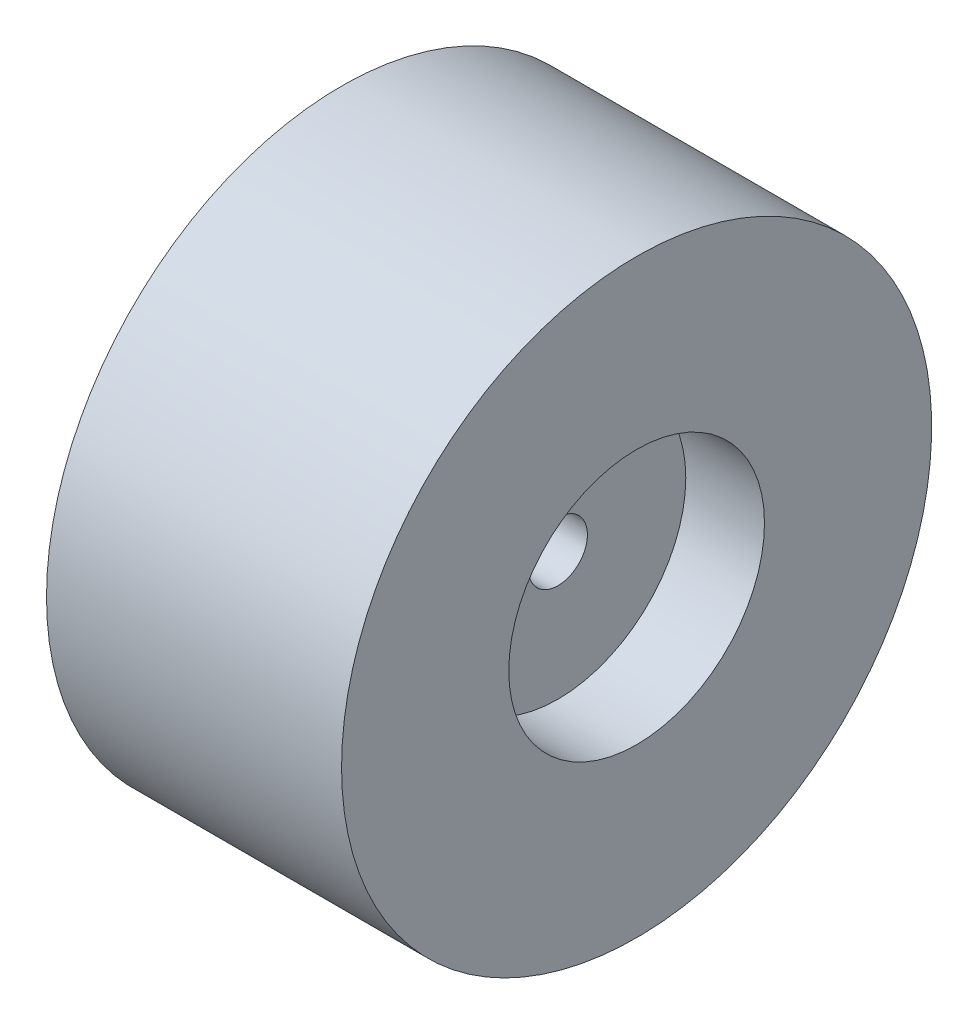
ISO-10303-21;
HEADER;
FILE_DESCRIPTION(('STEP AP214'),'2;1');
FILE_NAME('part.step','',(''),(''),'','','');
FILE_SCHEMA(('AUTOMOTIVE_DESIGN { 1 0 10303 214 1 1 1 1 }'));
ENDSEC;
DATA;
#1=APPLICATION_CONTEXT('core data for automotive mechanical design processes');
#2=APPLICATION_PROTOCOL_DEFINITION('international standard','automotive_design',2000,#1);
#3=PRODUCT_CONTEXT('',#1,'mechanical');
#4=PRODUCT('Part','Part','',(#3));
#5=PRODUCT_RELATED_PRODUCT_CATEGORY('part','',(#4));
#6=PRODUCT_DEFINITION_FORMATION('','',#4);
#7=PRODUCT_DEFINITION_CONTEXT('part definition',#1,'design');
#8=PRODUCT_DEFINITION('design','',#6,#7);
#9=PRODUCT_DEFINITION_SHAPE('','',#8);
#10=(LENGTH_UNIT() NAMED_UNIT(*) SI_UNIT(.MILLI.,.METRE.));
#11=(NAMED_UNIT(*) PLANE_ANGLE_UNIT() SI_UNIT($,.RADIAN.));
#12=(NAMED_UNIT(*) SI_UNIT($,.STERADIAN.) SOLID_ANGLE_UNIT());
#13=UNCERTAINTY_MEASURE_WITH_UNIT(LENGTH_MEASURE(1.E-05),#10,'distance_accuracy_value','');
#14=(GEOMETRIC_REPRESENTATION_CONTEXT(3) GLOBAL_UNCERTAINTY_ASSIGNED_CONTEXT((#13)) GLOBAL_UNIT_ASSIGNED_CONTEXT((#10,
#11,#12)) REPRESENTATION_CONTEXT('',''));
#15=CARTESIAN_POINT('',(0.,0.,0.));
#16=DIRECTION('',(0.,0.,1.));
#17=DIRECTION('',(1.,0.,0.));
#18=AXIS2_PLACEMENT_3D('',#15,#16,#17);
#19=CARTESIAN_POINT('',(-30.,0.,0.));
#20=DIRECTION('',(-1.,0.,0.));
#21=DIRECTION('',(0.,0.,1.));
#22=AXIS2_PLACEMENT_3D('',#19,#20,#21);
#23=CYLINDRICAL_SURFACE('',#22,30.);
#24=CARTESIAN_POINT('',(-30.,0.,0.));
#25=DIRECTION('',(-1.,0.,0.));
#26=DIRECTION('',(0.,0.,1.));
#27=AXIS2_PLACEMENT_3D('',#24,#25,#26);
#28=CIRCLE('',#27,30.);
#29=CARTESIAN_POINT('',(-30.,0.,30.));
#30=VERTEX_POINT('',#29);
#31=EDGE_CURVE('E10',#30,#30,#28,.T.);
#32=ORIENTED_EDGE('',*,*,#31,.F.);
#33=EDGE_LOOP('',(#32));
#34=FACE_BOUND('',#33,.T.);
#35=CARTESIAN_POINT('',(0.,0.,0.));
#36=DIRECTION('',(-1.,0.,0.));
#37=DIRECTION('',(0.,0.,1.));
#38=AXIS2_PLACEMENT_3D('',#35,#36,#37);
#39=CIRCLE('',#38,30.);
#40=CARTESIAN_POINT('',(0.,0.,30.));
#41=VERTEX_POINT('',#40);
#42=EDGE_CURVE('E66',#41,#41,#39,.T.);
#43=ORIENTED_EDGE('',*,*,#42,.T.);
#44=EDGE_LOOP('',(#43));
#45=FACE_BOUND('',#44,.T.);
#46=ADVANCED_FACE('F35',(#34,#45),#23,.T.);
#47=CARTESIAN_POINT('',(-30.,30.,0.));
#48=DIRECTION('',(1.,0.,0.));
#49=DIRECTION('',(0.,0.,-1.));
#50=AXIS2_PLACEMENT_3D('',#47,#48,#49);
#51=PLANE('',#50);
#52=CARTESIAN_POINT('',(-30.,0.,0.));
#53=DIRECTION('',(-1.,0.,0.));
#54=DIRECTION('',(0.,0.,1.));
#55=AXIS2_PLACEMENT_3D('',#52,#53,#54);
#56=CIRCLE('',#55,25.0829037686547);
#57=CARTESIAN_POINT('',(-30.,0.,25.0829037686547));
#58=VERTEX_POINT('',#57);
#59=EDGE_CURVE('E41',#58,#58,#56,.T.);
#60=ORIENTED_EDGE('',*,*,#59,.F.);
#61=EDGE_LOOP('',(#60));
#62=FACE_BOUND('',#61,.T.);
#63=ORIENTED_EDGE('',*,*,#31,.T.);
#64=EDGE_LOOP('',(#63));
#65=FACE_BOUND('',#64,.T.);
#66=ADVANCED_FACE('F109',(#62,#65),#51,.F.);
#67=CARTESIAN_POINT('',(-30.,0.,0.));
#68=DIRECTION('',(-1.,0.,0.));
#69=DIRECTION('',(0.,0.,1.));
#70=AXIS2_PLACEMENT_3D('',#67,#68,#69);
#71=CONICAL_SURFACE('',#70,25.0829037686547,0.785398163397433);
#72=CARTESIAN_POINT('',(-28.,0.,0.));
#73=DIRECTION('',(-1.,0.,0.));
#74=DIRECTION('',(0.,0.,1.));
#75=AXIS2_PLACEMENT_3D('',#72,#73,#74);
#76=CIRCLE('',#75,23.0829037686548);
#77=CARTESIAN_POINT('',(-28.,0.,23.0829037686548));
#78=VERTEX_POINT('',#77);
#79=EDGE_CURVE('E45',#78,#78,#76,.T.);
#80=ORIENTED_EDGE('',*,*,#79,.F.);
#81=EDGE_LOOP('',(#80));
#82=FACE_BOUND('',#81,.T.);
#83=ORIENTED_EDGE('',*,*,#59,.T.);
#84=EDGE_LOOP('',(#83));
#85=FACE_BOUND('',#84,.T.);
#86=ADVANCED_FACE('F104',(#82,#85),#71,.F.);
#87=CARTESIAN_POINT('',(-28.,0.,0.));
#88=DIRECTION('',(-1.,0.,0.));
#89=DIRECTION('',(0.,0.,1.));
#90=AXIS2_PLACEMENT_3D('',#87,#88,#89);
#91=CONICAL_SURFACE('',#90,23.0829037686548,0.5235987755983);
#92=CARTESIAN_POINT('',(-14.,0.,0.));
#93=DIRECTION('',(-1.,0.,0.));
#94=DIRECTION('',(0.,0.,1.));
#95=AXIS2_PLACEMENT_3D('',#92,#93,#94);
#96=CIRCLE('',#95,15.);
#97=CARTESIAN_POINT('',(-14.,0.,15.));
#98=VERTEX_POINT('',#97);
#99=EDGE_CURVE('E49',#98,#98,#96,.T.);
#100=ORIENTED_EDGE('',*,*,#99,.F.);
#101=EDGE_LOOP('',(#100));
#102=FACE_BOUND('',#101,.T.);
#103=ORIENTED_EDGE('',*,*,#79,.T.);
#104=EDGE_LOOP('',(#103));
#105=FACE_BOUND('',#104,.T.);
#106=ADVANCED_FACE('F98',(#102,#105),#91,.F.);
#107=CARTESIAN_POINT('',(-14.,15.,0.));
#108=DIRECTION('',(1.,0.,0.));
#109=DIRECTION('',(0.,0.,-1.));
#110=AXIS2_PLACEMENT_3D('',#107,#108,#109);
#111=PLANE('',#110);
#112=CARTESIAN_POINT('',(-14.,0.,0.));
#113=DIRECTION('',(-1.,0.,0.));
#114=DIRECTION('',(0.,0.,1.));
#115=AXIS2_PLACEMENT_3D('',#112,#113,#114);
#116=CIRCLE('',#115,3.);
#117=CARTESIAN_POINT('',(-14.,0.,3.));
#118=VERTEX_POINT('',#117);
#119=EDGE_CURVE('E54',#118,#118,#116,.T.);
#120=ORIENTED_EDGE('',*,*,#119,.F.);
#121=EDGE_LOOP('',(#120));
#122=FACE_BOUND('',#121,.T.);
#123=ORIENTED_EDGE('',*,*,#99,.T.);
#124=EDGE_LOOP('',(#123));
#125=FACE_BOUND('',#124,.T.);
#126=ADVANCED_FACE('F92',(#122,#125),#111,.F.);
#127=CARTESIAN_POINT('',(-30.,0.,0.));
#128=DIRECTION('',(-1.,0.,0.));
#129=DIRECTION('',(0.,0.,1.));
#130=AXIS2_PLACEMENT_3D('',#127,#128,#129);
#131=CYLINDRICAL_SURFACE('',#130,3.);
#132=CARTESIAN_POINT('',(-8.,0.,0.));
#133=DIRECTION('',(-1.,0.,0.));
#134=DIRECTION('',(0.,0.,1.));
#135=AXIS2_PLACEMENT_3D('',#132,#133,#134);
#136=CIRCLE('',#135,3.);
#137=CARTESIAN_POINT('',(-8.,0.,3.));
#138=VERTEX_POINT('',#137);
#139=EDGE_CURVE('E57',#138,#138,#136,.T.);
#140=ORIENTED_EDGE('',*,*,#139,.F.);
#141=EDGE_LOOP('',(#140));
#142=FACE_BOUND('',#141,.T.);
#143=ORIENTED_EDGE('',*,*,#119,.T.);
#144=EDGE_LOOP('',(#143));
#145=FACE_BOUND('',#144,.T.);
#146=ADVANCED_FACE('F86',(#142,#145),#131,.F.);
#147=CARTESIAN_POINT('',(-8.,3.,0.));
#148=DIRECTION('',(-1.,0.,0.));
#149=DIRECTION('',(0.,0.,1.));
#150=AXIS2_PLACEMENT_3D('',#147,#148,#149);
#151=PLANE('',#150);
#152=CARTESIAN_POINT('',(-8.,0.,0.));
#153=DIRECTION('',(-1.,0.,0.));
#154=DIRECTION('',(0.,0.,1.));
#155=AXIS2_PLACEMENT_3D('',#152,#153,#154);
#156=CIRCLE('',#155,13.);
#157=CARTESIAN_POINT('',(-8.,0.,13.));
#158=VERTEX_POINT('',#157);
#159=EDGE_CURVE('E60',#158,#158,#156,.T.);
#160=ORIENTED_EDGE('',*,*,#159,.F.);
#161=EDGE_LOOP('',(#160));
#162=FACE_BOUND('',#161,.T.);
#163=ORIENTED_EDGE('',*,*,#139,.T.);
#164=EDGE_LOOP('',(#163));
#165=FACE_BOUND('',#164,.T.);
#166=ADVANCED_FACE('F80',(#162,#165),#151,.F.);
#167=CARTESIAN_POINT('',(-30.,0.,0.));
#168=DIRECTION('',(-1.,0.,0.));
#169=DIRECTION('',(0.,0.,1.));
#170=AXIS2_PLACEMENT_3D('',#167,#168,#169);
#171=CYLINDRICAL_SURFACE('',#170,13.);
#172=CARTESIAN_POINT('',(0.,0.,0.));
#173=DIRECTION('',(-1.,0.,0.));
#174=DIRECTION('',(0.,0.,1.));
#175=AXIS2_PLACEMENT_3D('',#172,#173,#174);
#176=CIRCLE('',#175,13.);
#177=CARTESIAN_POINT('',(0.,0.,13.));
#178=VERTEX_POINT('',#177);
#179=EDGE_CURVE('E63',#178,#178,#176,.T.);
#180=ORIENTED_EDGE('',*,*,#179,.F.);
#181=EDGE_LOOP('',(#180));
#182=FACE_BOUND('',#181,.T.);
#183=ORIENTED_EDGE('',*,*,#159,.T.);
#184=EDGE_LOOP('',(#183));
#185=FACE_BOUND('',#184,.T.);
#186=ADVANCED_FACE('F74',(#182,#185),#171,.F.);
#187=CARTESIAN_POINT('',(0.,13.,0.));
#188=DIRECTION('',(-1.,0.,0.));
#189=DIRECTION('',(0.,0.,1.));
#190=AXIS2_PLACEMENT_3D('',#187,#188,#189);
#191=PLANE('',#190);
#192=ORIENTED_EDGE('',*,*,#42,.F.);
#193=EDGE_LOOP('',(#192));
#194=FACE_BOUND('',#193,.T.);
#195=ORIENTED_EDGE('',*,*,#179,.T.);
#196=EDGE_LOOP('',(#195));
#197=FACE_BOUND('',#196,.T.);
#198=ADVANCED_FACE('F71',(#194,#197),#191,.F.);
#199=CLOSED_SHELL('',(#46,#66,#86,#106,#126,#146,#166,#186,#198));
#200=MANIFOLD_SOLID_BREP('B2',#199);
#201=ADVANCED_BREP_SHAPE_REPRESENTATION('',(#18,#200),#14);
#202=SHAPE_DEFINITION_REPRESENTATION(#9,#201);
ENDSEC;
END-ISO-10303-21;
